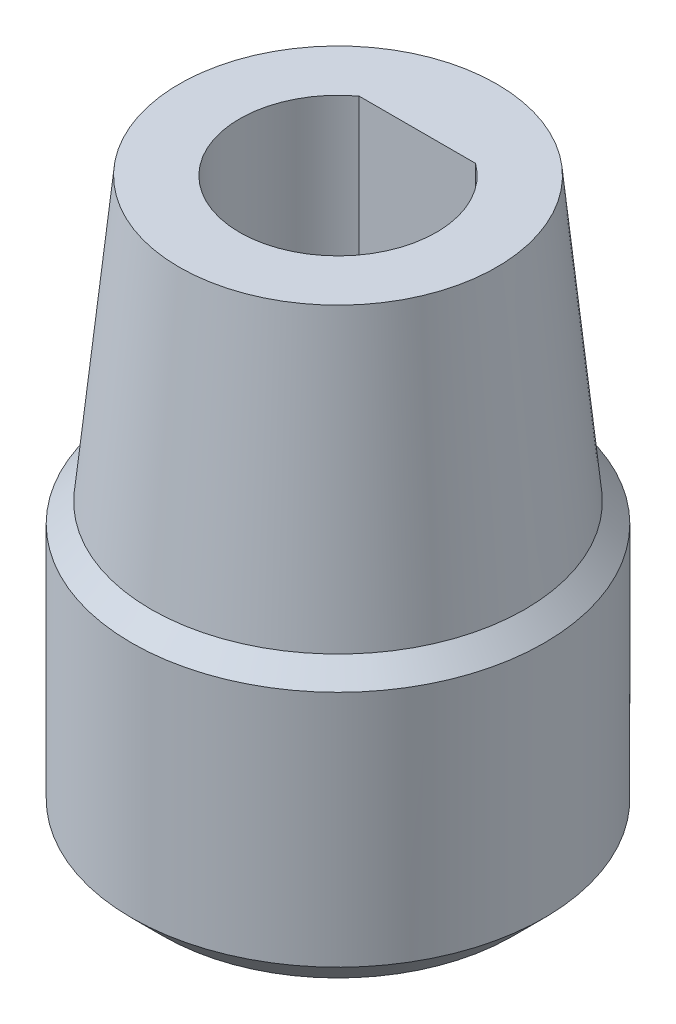
ISO-10303-21;
HEADER;
FILE_DESCRIPTION(('STEP AP214'),'2;1');
FILE_NAME('part.step','',(''),(''),'','','');
FILE_SCHEMA(('AUTOMOTIVE_DESIGN { 1 0 10303 214 1 1 1 1 }'));
ENDSEC;
DATA;
#1=APPLICATION_CONTEXT('core data for automotive mechanical design processes');
#2=APPLICATION_PROTOCOL_DEFINITION('international standard','automotive_design',2000,#1);
#3=PRODUCT_CONTEXT('',#1,'mechanical');
#4=PRODUCT('Part','Part','',(#3));
#5=PRODUCT_RELATED_PRODUCT_CATEGORY('part','',(#4));
#6=PRODUCT_DEFINITION_FORMATION('','',#4);
#7=PRODUCT_DEFINITION_CONTEXT('part definition',#1,'design');
#8=PRODUCT_DEFINITION('design','',#6,#7);
#9=PRODUCT_DEFINITION_SHAPE('','',#8);
#10=(LENGTH_UNIT() NAMED_UNIT(*) SI_UNIT(.MILLI.,.METRE.));
#11=(NAMED_UNIT(*) PLANE_ANGLE_UNIT() SI_UNIT($,.RADIAN.));
#12=(NAMED_UNIT(*) SI_UNIT($,.STERADIAN.) SOLID_ANGLE_UNIT());
#13=UNCERTAINTY_MEASURE_WITH_UNIT(LENGTH_MEASURE(1.E-05),#10,'distance_accuracy_value','');
#14=(GEOMETRIC_REPRESENTATION_CONTEXT(3) GLOBAL_UNCERTAINTY_ASSIGNED_CONTEXT((#13)) GLOBAL_UNIT_ASSIGNED_CONTEXT((#10,
#11,#12)) REPRESENTATION_CONTEXT('',''));
#15=CARTESIAN_POINT('',(0.,0.,0.));
#16=DIRECTION('',(0.,0.,1.));
#17=DIRECTION('',(1.,0.,0.));
#18=AXIS2_PLACEMENT_3D('',#15,#16,#17);
#19=CARTESIAN_POINT('',(0.,10.,0.));
#20=DIRECTION('',(0.,-1.,0.));
#21=DIRECTION('',(0.,0.,-1.));
#22=AXIS2_PLACEMENT_3D('',#19,#20,#21);
#23=CYLINDRICAL_SURFACE('',#22,3.1);
#24=CARTESIAN_POINT('',(0.,3.,0.));
#25=DIRECTION('',(0.,1.,0.));
#26=DIRECTION('',(0.,0.,1.));
#27=AXIS2_PLACEMENT_3D('',#24,#25,#26);
#28=CIRCLE('',#27,3.1);
#29=CARTESIAN_POINT('',(-1.83303027798234,3.,-2.5));
#30=VERTEX_POINT('',#29);
#31=CARTESIAN_POINT('',(1.83303027798234,3.,-2.5));
#32=VERTEX_POINT('',#31);
#33=EDGE_CURVE('E54',#30,#32,#28,.T.);
#34=ORIENTED_EDGE('',*,*,#33,.F.);
#35=DIRECTION('',(0.,-1.,0.));
#36=VECTOR('',#35,1.);
#37=CARTESIAN_POINT('',(-1.83303027798234,10.,-2.5));
#38=LINE('',#37,#36);
#39=CARTESIAN_POINT('',(-1.83303027798234,10.,-2.5));
#40=VERTEX_POINT('',#39);
#41=EDGE_CURVE('E73',#40,#30,#38,.T.);
#42=ORIENTED_EDGE('',*,*,#41,.F.);
#43=CARTESIAN_POINT('',(0.,10.,0.));
#44=DIRECTION('',(0.,1.,0.));
#45=DIRECTION('',(0.,0.,1.));
#46=AXIS2_PLACEMENT_3D('',#43,#44,#45);
#47=CIRCLE('',#46,3.1);
#48=CARTESIAN_POINT('',(1.83303027798234,10.,-2.5));
#49=VERTEX_POINT('',#48);
#50=EDGE_CURVE('E78',#40,#49,#47,.T.);
#51=ORIENTED_EDGE('',*,*,#50,.T.);
#52=DIRECTION('',(0.,-1.,0.));
#53=VECTOR('',#52,1.);
#54=CARTESIAN_POINT('',(1.83303027798234,10.,-2.5));
#55=LINE('',#54,#53);
#56=EDGE_CURVE('E77',#49,#32,#55,.T.);
#57=ORIENTED_EDGE('',*,*,#56,.T.);
#58=EDGE_LOOP('',(#34,#42,#51,#57));
#59=FACE_BOUND('',#58,.T.);
#60=ADVANCED_FACE('F40',(#59),#23,.F.);
#61=CARTESIAN_POINT('',(0.,10.,-2.5));
#62=DIRECTION('',(0.,0.,-1.));
#63=DIRECTION('',(-1.,0.,0.));
#64=AXIS2_PLACEMENT_3D('',#61,#62,#63);
#65=PLANE('',#64);
#66=ORIENTED_EDGE('',*,*,#41,.T.);
#67=DIRECTION('',(1.,0.,0.));
#68=VECTOR('',#67,1.);
#69=CARTESIAN_POINT('',(0.,3.,-2.5));
#70=LINE('',#69,#68);
#71=EDGE_CURVE('E67',#30,#32,#70,.T.);
#72=ORIENTED_EDGE('',*,*,#71,.T.);
#73=ORIENTED_EDGE('',*,*,#56,.F.);
#74=DIRECTION('',(1.,0.,0.));
#75=VECTOR('',#74,1.);
#76=CARTESIAN_POINT('',(0.,10.,-2.5));
#77=LINE('',#76,#75);
#78=EDGE_CURVE('E61',#40,#49,#77,.T.);
#79=ORIENTED_EDGE('',*,*,#78,.F.);
#80=EDGE_LOOP('',(#66,#72,#73,#79));
#81=FACE_BOUND('',#80,.T.);
#82=ADVANCED_FACE('F81',(#81),#65,.F.);
#83=CARTESIAN_POINT('',(0.,10.,0.));
#84=DIRECTION('',(0.,1.,0.));
#85=DIRECTION('',(0.,0.,1.));
#86=AXIS2_PLACEMENT_3D('',#83,#84,#85);
#87=PLANE('',#86);
#88=CARTESIAN_POINT('',(0.,10.,0.));
#89=DIRECTION('',(0.,1.,0.));
#90=DIRECTION('',(0.,0.,1.));
#91=AXIS2_PLACEMENT_3D('',#88,#89,#90);
#92=CIRCLE('',#91,5.);
#93=CARTESIAN_POINT('',(0.,10.,5.));
#94=VERTEX_POINT('',#93);
#95=EDGE_CURVE('E91',#94,#94,#92,.T.);
#96=ORIENTED_EDGE('',*,*,#95,.T.);
#97=EDGE_LOOP('',(#96));
#98=FACE_BOUND('',#97,.T.);
#99=ORIENTED_EDGE('',*,*,#50,.F.);
#100=ORIENTED_EDGE('',*,*,#78,.T.);
#101=EDGE_LOOP('',(#99,#100));
#102=FACE_BOUND('',#101,.T.);
#103=ADVANCED_FACE('F116',(#98,#102),#87,.T.);
#104=CARTESIAN_POINT('',(0.,3.,0.));
#105=DIRECTION('',(0.,1.,0.));
#106=DIRECTION('',(0.,0.,1.));
#107=AXIS2_PLACEMENT_3D('',#104,#105,#106);
#108=PLANE('',#107);
#109=ORIENTED_EDGE('',*,*,#71,.F.);
#110=ORIENTED_EDGE('',*,*,#33,.T.);
#111=EDGE_LOOP('',(#109,#110));
#112=FACE_BOUND('',#111,.T.);
#113=ADVANCED_FACE('F68',(#112),#108,.T.);
#114=CARTESIAN_POINT('',(0.,-8.,0.));
#115=DIRECTION('',(0.,1.,0.));
#116=DIRECTION('',(0.,0.,1.));
#117=AXIS2_PLACEMENT_3D('',#114,#115,#116);
#118=CYLINDRICAL_SURFACE('',#117,6.5);
#119=CARTESIAN_POINT('',(0.,-7.,0.));
#120=DIRECTION('',(0.,1.,0.));
#121=DIRECTION('',(0.,0.,1.));
#122=AXIS2_PLACEMENT_3D('',#119,#120,#121);
#123=CIRCLE('',#122,6.5);
#124=CARTESIAN_POINT('',(0.,-7.,6.5));
#125=VERTEX_POINT('',#124);
#126=EDGE_CURVE('E48',#125,#125,#123,.T.);
#127=ORIENTED_EDGE('',*,*,#126,.T.);
#128=EDGE_LOOP('',(#127));
#129=FACE_BOUND('',#128,.T.);
#130=CARTESIAN_POINT('',(0.,0.5,0.));
#131=DIRECTION('',(0.,-1.,0.));
#132=DIRECTION('',(0.,0.,-1.));
#133=AXIS2_PLACEMENT_3D('',#130,#131,#132);
#134=CIRCLE('',#133,6.5);
#135=CARTESIAN_POINT('',(0.,0.5,-6.5));
#136=VERTEX_POINT('',#135);
#137=EDGE_CURVE('E88',#136,#136,#134,.T.);
#138=ORIENTED_EDGE('',*,*,#137,.T.);
#139=EDGE_LOOP('',(#138));
#140=FACE_BOUND('',#139,.T.);
#141=ADVANCED_FACE('F99',(#129,#140),#118,.T.);
#142=CARTESIAN_POINT('',(0.,-8.,0.));
#143=DIRECTION('',(0.,1.,0.));
#144=DIRECTION('',(0.,0.,1.));
#145=AXIS2_PLACEMENT_3D('',#142,#143,#144);
#146=CYLINDRICAL_SURFACE('',#145,4.9);
#147=CARTESIAN_POINT('',(0.,-8.,0.));
#148=DIRECTION('',(0.,1.,0.));
#149=DIRECTION('',(0.,0.,1.));
#150=AXIS2_PLACEMENT_3D('',#147,#148,#149);
#151=CIRCLE('',#150,4.9);
#152=CARTESIAN_POINT('',(0.,-8.,4.9));
#153=VERTEX_POINT('',#152);
#154=EDGE_CURVE('E79',#153,#153,#151,.T.);
#155=ORIENTED_EDGE('',*,*,#154,.F.);
#156=EDGE_LOOP('',(#155));
#157=FACE_BOUND('',#156,.T.);
#158=CARTESIAN_POINT('',(0.,0.,0.));
#159=DIRECTION('',(0.,1.,0.));
#160=DIRECTION('',(0.,0.,1.));
#161=AXIS2_PLACEMENT_3D('',#158,#159,#160);
#162=CIRCLE('',#161,4.9);
#163=CARTESIAN_POINT('',(0.,0.,4.9));
#164=VERTEX_POINT('',#163);
#165=EDGE_CURVE('E72',#164,#164,#162,.T.);
#166=ORIENTED_EDGE('',*,*,#165,.T.);
#167=EDGE_LOOP('',(#166));
#168=FACE_BOUND('',#167,.T.);
#169=ADVANCED_FACE('F132',(#157,#168),#146,.F.);
#170=CARTESIAN_POINT('',(0.,-8.,0.));
#171=DIRECTION('',(0.,1.,0.));
#172=DIRECTION('',(0.,0.,1.));
#173=AXIS2_PLACEMENT_3D('',#170,#171,#172);
#174=PLANE('',#173);
#175=CARTESIAN_POINT('',(0.,-8.,0.));
#176=DIRECTION('',(0.,1.,0.));
#177=DIRECTION('',(0.,0.,1.));
#178=AXIS2_PLACEMENT_3D('',#175,#176,#177);
#179=CIRCLE('',#178,5.5);
#180=CARTESIAN_POINT('',(0.,-8.,5.5));
#181=VERTEX_POINT('',#180);
#182=EDGE_CURVE('E12',#181,#181,#179,.F.);
#183=ORIENTED_EDGE('',*,*,#182,.T.);
#184=EDGE_LOOP('',(#183));
#185=FACE_BOUND('',#184,.T.);
#186=ORIENTED_EDGE('',*,*,#154,.T.);
#187=EDGE_LOOP('',(#186));
#188=FACE_BOUND('',#187,.T.);
#189=ADVANCED_FACE('F126',(#185,#188),#174,.F.);
#190=CARTESIAN_POINT('',(0.,0.,0.));
#191=DIRECTION('',(0.,1.,0.));
#192=DIRECTION('',(0.,0.,1.));
#193=AXIS2_PLACEMENT_3D('',#190,#191,#192);
#194=PLANE('',#193);
#195=ORIENTED_EDGE('',*,*,#165,.F.);
#196=EDGE_LOOP('',(#195));
#197=FACE_BOUND('',#196,.T.);
#198=ADVANCED_FACE('F121',(#197),#194,.F.);
#199=CARTESIAN_POINT('',(0.,0.999999999999999,0.));
#200=DIRECTION('',(0.,-1.,0.));
#201=DIRECTION('',(0.,0.,-1.));
#202=AXIS2_PLACEMENT_3D('',#199,#200,#201);
#203=CONICAL_SURFACE('',#202,6.,0.785398163397449);
#204=CARTESIAN_POINT('',(0.,1.11111111111111,0.));
#205=DIRECTION('',(0.,-1.,0.));
#206=DIRECTION('',(0.,0.,-1.));
#207=AXIS2_PLACEMENT_3D('',#204,#205,#206);
#208=CIRCLE('',#207,5.88888888888889);
#209=CARTESIAN_POINT('',(0.,1.11111111111111,-5.88888888888889));
#210=VERTEX_POINT('',#209);
#211=EDGE_CURVE('E94',#210,#210,#208,.T.);
#212=ORIENTED_EDGE('',*,*,#211,.T.);
#213=EDGE_LOOP('',(#212));
#214=FACE_BOUND('',#213,.T.);
#215=ORIENTED_EDGE('',*,*,#137,.F.);
#216=EDGE_LOOP('',(#215));
#217=FACE_BOUND('',#216,.T.);
#218=ADVANCED_FACE('F108',(#214,#217),#203,.T.);
#219=CARTESIAN_POINT('',(0.,10.,0.));
#220=DIRECTION('',(0.,-1.,0.));
#221=DIRECTION('',(0.,0.,-1.));
#222=AXIS2_PLACEMENT_3D('',#219,#220,#221);
#223=CONICAL_SURFACE('',#222,5.,0.099668652491162);
#224=ORIENTED_EDGE('',*,*,#211,.F.);
#225=EDGE_LOOP('',(#224));
#226=FACE_BOUND('',#225,.T.);
#227=ORIENTED_EDGE('',*,*,#95,.F.);
#228=EDGE_LOOP('',(#227));
#229=FACE_BOUND('',#228,.T.);
#230=ADVANCED_FACE('F103',(#226,#229),#223,.T.);
#231=CARTESIAN_POINT('',(0.,-7.,0.));
#232=DIRECTION('',(0.,1.,0.));
#233=DIRECTION('',(0.,0.,1.));
#234=AXIS2_PLACEMENT_3D('',#231,#232,#233);
#235=CONICAL_SURFACE('',#234,6.5,0.78539816339745);
#236=ORIENTED_EDGE('',*,*,#182,.F.);
#237=EDGE_LOOP('',(#236));
#238=FACE_BOUND('',#237,.T.);
#239=ORIENTED_EDGE('',*,*,#126,.F.);
#240=EDGE_LOOP('',(#239));
#241=FACE_BOUND('',#240,.T.);
#242=ADVANCED_FACE('F42',(#238,#241),#235,.T.);
#243=CLOSED_SHELL('',(#60,#82,#103,#113,#141,#169,#189,#198,#218,#230,#242));
#244=MANIFOLD_SOLID_BREP('B2',#243);
#245=ADVANCED_BREP_SHAPE_REPRESENTATION('',(#18,#244),#14);
#246=SHAPE_DEFINITION_REPRESENTATION(#9,#245);
ENDSEC;
END-ISO-10303-21;
